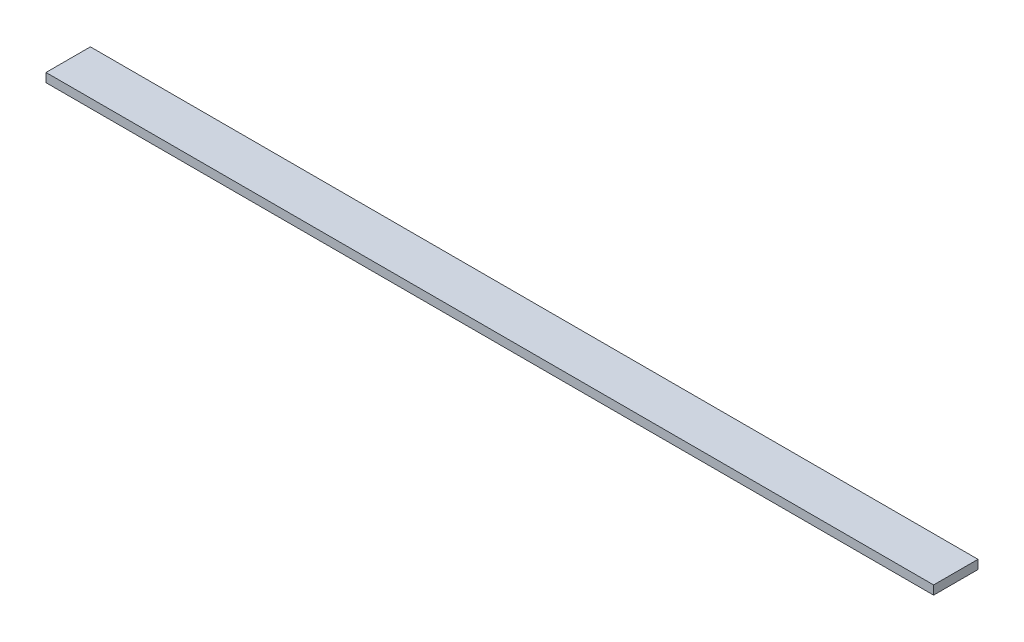
ISO-10303-21;
HEADER;
FILE_DESCRIPTION(('STEP AP214'),'2;1');
FILE_NAME('part.step','',(''),(''),'','','');
FILE_SCHEMA(('AUTOMOTIVE_DESIGN { 1 0 10303 214 1 1 1 1 }'));
ENDSEC;
DATA;
#1=APPLICATION_CONTEXT('core data for automotive mechanical design processes');
#2=APPLICATION_PROTOCOL_DEFINITION('international standard','automotive_design',2000,#1);
#3=PRODUCT_CONTEXT('',#1,'mechanical');
#4=PRODUCT('Part','Part','',(#3));
#5=PRODUCT_RELATED_PRODUCT_CATEGORY('part','',(#4));
#6=PRODUCT_DEFINITION_FORMATION('','',#4);
#7=PRODUCT_DEFINITION_CONTEXT('part definition',#1,'design');
#8=PRODUCT_DEFINITION('design','',#6,#7);
#9=PRODUCT_DEFINITION_SHAPE('','',#8);
#10=(LENGTH_UNIT() NAMED_UNIT(*) SI_UNIT(.MILLI.,.METRE.));
#11=(NAMED_UNIT(*) PLANE_ANGLE_UNIT() SI_UNIT($,.RADIAN.));
#12=(NAMED_UNIT(*) SI_UNIT($,.STERADIAN.) SOLID_ANGLE_UNIT());
#13=UNCERTAINTY_MEASURE_WITH_UNIT(LENGTH_MEASURE(1.E-05),#10,'distance_accuracy_value','');
#14=(GEOMETRIC_REPRESENTATION_CONTEXT(3) GLOBAL_UNCERTAINTY_ASSIGNED_CONTEXT((#13)) GLOBAL_UNIT_ASSIGNED_CONTEXT((#10,
#11,#12)) REPRESENTATION_CONTEXT('',''));
#15=CARTESIAN_POINT('',(0.,0.,0.));
#16=DIRECTION('',(0.,0.,1.));
#17=DIRECTION('',(1.,0.,0.));
#18=AXIS2_PLACEMENT_3D('',#15,#16,#17);
#19=CARTESIAN_POINT('',(150.,1040.,-40.));
#20=DIRECTION('',(-1.,0.,0.));
#21=DIRECTION('',(0.,0.,1.));
#22=AXIS2_PLACEMENT_3D('',#19,#20,#21);
#23=PLANE('',#22);
#24=DIRECTION('',(0.,-1.,0.));
#25=VECTOR('',#24,1.);
#26=CARTESIAN_POINT('',(150.,1040.,-20.));
#27=LINE('',#26,#25);
#28=CARTESIAN_POINT('',(150.,1044.,-20.));
#29=VERTEX_POINT('',#28);
#30=CARTESIAN_POINT('',(150.,1040.,-20.));
#31=VERTEX_POINT('',#30);
#32=EDGE_CURVE('E103',#29,#31,#27,.T.);
#33=ORIENTED_EDGE('',*,*,#32,.F.);
#34=DIRECTION('',(0.,0.,1.));
#35=VECTOR('',#34,1.);
#36=CARTESIAN_POINT('',(150.,1044.,-40.));
#37=LINE('',#36,#35);
#38=CARTESIAN_POINT('',(150.,1044.,-40.));
#39=VERTEX_POINT('',#38);
#40=EDGE_CURVE('E11',#39,#29,#37,.T.);
#41=ORIENTED_EDGE('',*,*,#40,.F.);
#42=DIRECTION('',(0.,-1.,0.));
#43=VECTOR('',#42,1.);
#44=CARTESIAN_POINT('',(150.,1040.,-40.));
#45=LINE('',#44,#43);
#46=CARTESIAN_POINT('',(150.,1040.,-40.));
#47=VERTEX_POINT('',#46);
#48=EDGE_CURVE('E97',#39,#47,#45,.T.);
#49=ORIENTED_EDGE('',*,*,#48,.T.);
#50=DIRECTION('',(0.,0.,1.));
#51=VECTOR('',#50,1.);
#52=CARTESIAN_POINT('',(150.,1040.,-40.));
#53=LINE('',#52,#51);
#54=EDGE_CURVE('E42',#47,#31,#53,.T.);
#55=ORIENTED_EDGE('',*,*,#54,.T.);
#56=EDGE_LOOP('',(#33,#41,#49,#55));
#57=FACE_BOUND('',#56,.T.);
#58=ADVANCED_FACE('F39',(#57),#23,.T.);
#59=CARTESIAN_POINT('',(150.,1044.,-40.));
#60=DIRECTION('',(0.,1.,0.));
#61=DIRECTION('',(0.,0.,1.));
#62=AXIS2_PLACEMENT_3D('',#59,#60,#61);
#63=PLANE('',#62);
#64=DIRECTION('',(-1.,0.,0.));
#65=VECTOR('',#64,1.);
#66=CARTESIAN_POINT('',(150.,1044.,-20.));
#67=LINE('',#66,#65);
#68=CARTESIAN_POINT('',(550.,1044.,-20.));
#69=VERTEX_POINT('',#68);
#70=EDGE_CURVE('E99',#69,#29,#67,.T.);
#71=ORIENTED_EDGE('',*,*,#70,.F.);
#72=DIRECTION('',(0.,0.,1.));
#73=VECTOR('',#72,1.);
#74=CARTESIAN_POINT('',(550.,1044.,-40.));
#75=LINE('',#74,#73);
#76=CARTESIAN_POINT('',(550.,1044.,-40.));
#77=VERTEX_POINT('',#76);
#78=EDGE_CURVE('E48',#77,#69,#75,.T.);
#79=ORIENTED_EDGE('',*,*,#78,.F.);
#80=DIRECTION('',(-1.,0.,0.));
#81=VECTOR('',#80,1.);
#82=CARTESIAN_POINT('',(150.,1044.,-40.));
#83=LINE('',#82,#81);
#84=EDGE_CURVE('E94',#77,#39,#83,.T.);
#85=ORIENTED_EDGE('',*,*,#84,.T.);
#86=ORIENTED_EDGE('',*,*,#40,.T.);
#87=EDGE_LOOP('',(#71,#79,#85,#86));
#88=FACE_BOUND('',#87,.T.);
#89=ADVANCED_FACE('F113',(#88),#63,.T.);
#90=CARTESIAN_POINT('',(550.,1040.,-40.));
#91=DIRECTION('',(1.,0.,0.));
#92=DIRECTION('',(0.,0.,-1.));
#93=AXIS2_PLACEMENT_3D('',#90,#91,#92);
#94=PLANE('',#93);
#95=DIRECTION('',(0.,1.,0.));
#96=VECTOR('',#95,1.);
#97=CARTESIAN_POINT('',(550.,1040.,-20.));
#98=LINE('',#97,#96);
#99=CARTESIAN_POINT('',(550.,1040.,-20.));
#100=VERTEX_POINT('',#99);
#101=EDGE_CURVE('E89',#100,#69,#98,.T.);
#102=ORIENTED_EDGE('',*,*,#101,.F.);
#103=DIRECTION('',(0.,0.,1.));
#104=VECTOR('',#103,1.);
#105=CARTESIAN_POINT('',(550.,1040.,-40.));
#106=LINE('',#105,#104);
#107=CARTESIAN_POINT('',(550.,1040.,-40.));
#108=VERTEX_POINT('',#107);
#109=EDGE_CURVE('E84',#108,#100,#106,.T.);
#110=ORIENTED_EDGE('',*,*,#109,.F.);
#111=DIRECTION('',(0.,1.,0.));
#112=VECTOR('',#111,1.);
#113=CARTESIAN_POINT('',(550.,1040.,-40.));
#114=LINE('',#113,#112);
#115=EDGE_CURVE('E87',#108,#77,#114,.T.);
#116=ORIENTED_EDGE('',*,*,#115,.T.);
#117=ORIENTED_EDGE('',*,*,#78,.T.);
#118=EDGE_LOOP('',(#102,#110,#116,#117));
#119=FACE_BOUND('',#118,.T.);
#120=ADVANCED_FACE('F86',(#119),#94,.T.);
#121=CARTESIAN_POINT('',(150.,1040.,-40.));
#122=DIRECTION('',(0.,-1.,0.));
#123=DIRECTION('',(0.,0.,-1.));
#124=AXIS2_PLACEMENT_3D('',#121,#122,#123);
#125=PLANE('',#124);
#126=DIRECTION('',(1.,0.,0.));
#127=VECTOR('',#126,1.);
#128=CARTESIAN_POINT('',(150.,1040.,-20.));
#129=LINE('',#128,#127);
#130=EDGE_CURVE('E106',#31,#100,#129,.T.);
#131=ORIENTED_EDGE('',*,*,#130,.F.);
#132=ORIENTED_EDGE('',*,*,#54,.F.);
#133=DIRECTION('',(1.,0.,0.));
#134=VECTOR('',#133,1.);
#135=CARTESIAN_POINT('',(150.,1040.,-40.));
#136=LINE('',#135,#134);
#137=EDGE_CURVE('E93',#47,#108,#136,.T.);
#138=ORIENTED_EDGE('',*,*,#137,.T.);
#139=ORIENTED_EDGE('',*,*,#109,.T.);
#140=EDGE_LOOP('',(#131,#132,#138,#139));
#141=FACE_BOUND('',#140,.T.);
#142=ADVANCED_FACE('F96',(#141),#125,.T.);
#143=CARTESIAN_POINT('',(0.,0.,-40.));
#144=DIRECTION('',(0.,0.,-1.));
#145=DIRECTION('',(-1.,0.,0.));
#146=AXIS2_PLACEMENT_3D('',#143,#144,#145);
#147=PLANE('',#146);
#148=ORIENTED_EDGE('',*,*,#48,.F.);
#149=ORIENTED_EDGE('',*,*,#84,.F.);
#150=ORIENTED_EDGE('',*,*,#115,.F.);
#151=ORIENTED_EDGE('',*,*,#137,.F.);
#152=EDGE_LOOP('',(#148,#149,#150,#151));
#153=FACE_BOUND('',#152,.T.);
#154=ADVANCED_FACE('F92',(#153),#147,.T.);
#155=CARTESIAN_POINT('',(0.,0.,-20.));
#156=DIRECTION('',(0.,0.,-1.));
#157=DIRECTION('',(-1.,0.,0.));
#158=AXIS2_PLACEMENT_3D('',#155,#156,#157);
#159=PLANE('',#158);
#160=ORIENTED_EDGE('',*,*,#32,.T.);
#161=ORIENTED_EDGE('',*,*,#130,.T.);
#162=ORIENTED_EDGE('',*,*,#101,.T.);
#163=ORIENTED_EDGE('',*,*,#70,.T.);
#164=EDGE_LOOP('',(#160,#161,#162,#163));
#165=FACE_BOUND('',#164,.T.);
#166=ADVANCED_FACE('F112',(#165),#159,.F.);
#167=CLOSED_SHELL('',(#58,#89,#120,#142,#154,#166));
#168=MANIFOLD_SOLID_BREP('B2',#167);
#169=ADVANCED_BREP_SHAPE_REPRESENTATION('',(#18,#168),#14);
#170=SHAPE_DEFINITION_REPRESENTATION(#9,#169);
ENDSEC;
END-ISO-10303-21;
